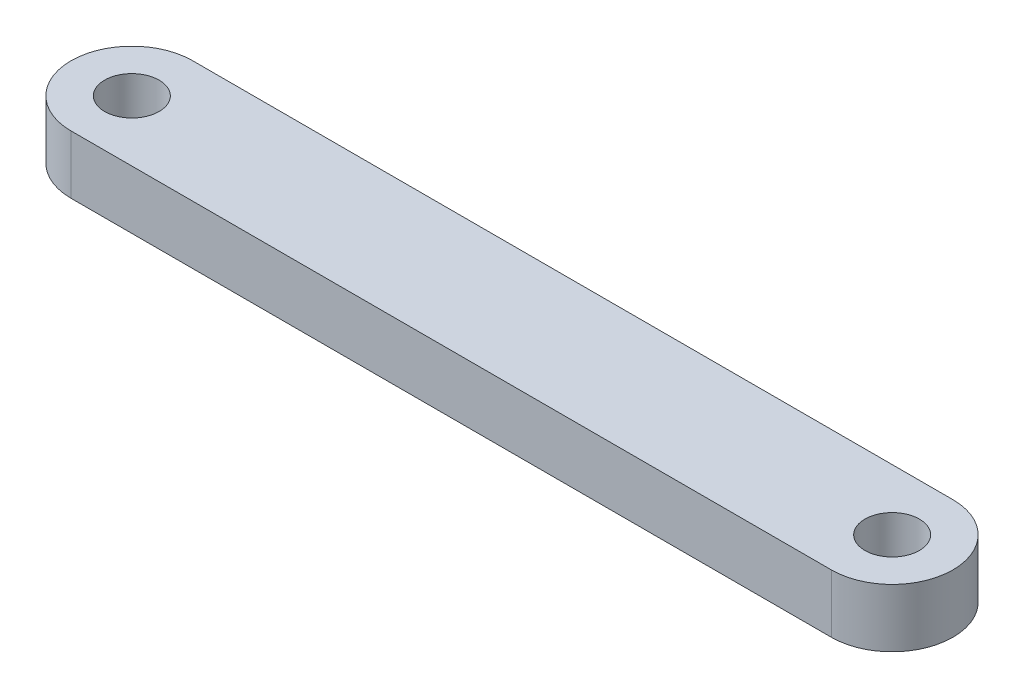
ISO-10303-21;
HEADER;
FILE_DESCRIPTION(('STEP AP214'),'2;1');
FILE_NAME('part.step','',(''),(''),'','','');
FILE_SCHEMA(('AUTOMOTIVE_DESIGN { 1 0 10303 214 1 1 1 1 }'));
ENDSEC;
DATA;
#1=APPLICATION_CONTEXT('core data for automotive mechanical design processes');
#2=APPLICATION_PROTOCOL_DEFINITION('international standard','automotive_design',2000,#1);
#3=PRODUCT_CONTEXT('',#1,'mechanical');
#4=PRODUCT('Part','Part','',(#3));
#5=PRODUCT_RELATED_PRODUCT_CATEGORY('part','',(#4));
#6=PRODUCT_DEFINITION_FORMATION('','',#4);
#7=PRODUCT_DEFINITION_CONTEXT('part definition',#1,'design');
#8=PRODUCT_DEFINITION('design','',#6,#7);
#9=PRODUCT_DEFINITION_SHAPE('','',#8);
#10=(LENGTH_UNIT() NAMED_UNIT(*) SI_UNIT(.MILLI.,.METRE.));
#11=(NAMED_UNIT(*) PLANE_ANGLE_UNIT() SI_UNIT($,.RADIAN.));
#12=(NAMED_UNIT(*) SI_UNIT($,.STERADIAN.) SOLID_ANGLE_UNIT());
#13=UNCERTAINTY_MEASURE_WITH_UNIT(LENGTH_MEASURE(1.E-05),#10,'distance_accuracy_value','');
#14=(GEOMETRIC_REPRESENTATION_CONTEXT(3) GLOBAL_UNCERTAINTY_ASSIGNED_CONTEXT((#13)) GLOBAL_UNIT_ASSIGNED_CONTEXT((#10,
#11,#12)) REPRESENTATION_CONTEXT('',''));
#15=CARTESIAN_POINT('',(0.,0.,0.));
#16=DIRECTION('',(0.,0.,1.));
#17=DIRECTION('',(1.,0.,0.));
#18=AXIS2_PLACEMENT_3D('',#15,#16,#17);
#19=CARTESIAN_POINT('',(-19.8501,3.048,0.));
#20=DIRECTION('',(0.,1.,0.));
#21=DIRECTION('',(0.,0.,1.));
#22=AXIS2_PLACEMENT_3D('',#19,#20,#21);
#23=PLANE('',#22);
#24=CARTESIAN_POINT('',(-19.8501,3.048,0.));
#25=DIRECTION('',(0.,1.,0.));
#26=DIRECTION('',(0.,0.,1.));
#27=AXIS2_PLACEMENT_3D('',#24,#25,#26);
#28=CIRCLE('',#27,1.4224);
#29=CARTESIAN_POINT('',(-19.8501,3.048,-1.4224));
#30=VERTEX_POINT('',#29);
#31=EDGE_CURVE('E100',#30,#30,#28,.T.);
#32=ORIENTED_EDGE('',*,*,#31,.F.);
#33=EDGE_LOOP('',(#32));
#34=FACE_BOUND('',#33,.T.);
#35=CARTESIAN_POINT('',(-19.8501,3.048,0.));
#36=DIRECTION('',(0.,1.,0.));
#37=DIRECTION('',(0.,0.,1.));
#38=AXIS2_PLACEMENT_3D('',#35,#36,#37);
#39=CIRCLE('',#38,3.175);
#40=CARTESIAN_POINT('',(-19.8501,3.048,-3.175));
#41=VERTEX_POINT('',#40);
#42=CARTESIAN_POINT('',(-19.8501,3.048,3.175));
#43=VERTEX_POINT('',#42);
#44=EDGE_CURVE('E85',#41,#43,#39,.T.);
#45=ORIENTED_EDGE('',*,*,#44,.T.);
#46=DIRECTION('',(1.,0.,0.));
#47=VECTOR('',#46,1.);
#48=CARTESIAN_POINT('',(-19.8501,3.048,3.175));
#49=LINE('',#48,#47);
#50=CARTESIAN_POINT('',(19.8501,3.048,3.17499999999999));
#51=VERTEX_POINT('',#50);
#52=EDGE_CURVE('E80',#43,#51,#49,.T.);
#53=ORIENTED_EDGE('',*,*,#52,.T.);
#54=CARTESIAN_POINT('',(19.8501,3.048,0.));
#55=DIRECTION('',(0.,1.,0.));
#56=DIRECTION('',(0.,0.,1.));
#57=AXIS2_PLACEMENT_3D('',#54,#55,#56);
#58=CIRCLE('',#57,3.175);
#59=CARTESIAN_POINT('',(19.8501,3.048,-3.17500000000001));
#60=VERTEX_POINT('',#59);
#61=EDGE_CURVE('E83',#51,#60,#58,.T.);
#62=ORIENTED_EDGE('',*,*,#61,.T.);
#63=DIRECTION('',(-1.,0.,0.));
#64=VECTOR('',#63,1.);
#65=CARTESIAN_POINT('',(-19.8501,3.048,-3.175));
#66=LINE('',#65,#64);
#67=EDGE_CURVE('E50',#60,#41,#66,.T.);
#68=ORIENTED_EDGE('',*,*,#67,.T.);
#69=EDGE_LOOP('',(#45,#53,#62,#68));
#70=FACE_BOUND('',#69,.T.);
#71=CARTESIAN_POINT('',(19.8501,3.048,0.));
#72=DIRECTION('',(0.,1.,0.));
#73=DIRECTION('',(0.,0.,1.));
#74=AXIS2_PLACEMENT_3D('',#71,#72,#73);
#75=CIRCLE('',#74,1.4224);
#76=CARTESIAN_POINT('',(19.8501,3.048,-1.42240000000001));
#77=VERTEX_POINT('',#76);
#78=EDGE_CURVE('E115',#77,#77,#75,.T.);
#79=ORIENTED_EDGE('',*,*,#78,.F.);
#80=EDGE_LOOP('',(#79));
#81=FACE_BOUND('',#80,.T.);
#82=ADVANCED_FACE('F33',(#34,#70,#81),#23,.T.);
#83=CARTESIAN_POINT('',(-19.8501,0.,0.));
#84=DIRECTION('',(0.,1.,0.));
#85=DIRECTION('',(0.,0.,1.));
#86=AXIS2_PLACEMENT_3D('',#83,#84,#85);
#87=PLANE('',#86);
#88=CARTESIAN_POINT('',(-19.8501,0.,0.));
#89=DIRECTION('',(0.,1.,0.));
#90=DIRECTION('',(0.,0.,1.));
#91=AXIS2_PLACEMENT_3D('',#88,#89,#90);
#92=CIRCLE('',#91,1.4224);
#93=CARTESIAN_POINT('',(-19.8501,0.,-1.4224));
#94=VERTEX_POINT('',#93);
#95=EDGE_CURVE('E112',#94,#94,#92,.T.);
#96=ORIENTED_EDGE('',*,*,#95,.T.);
#97=EDGE_LOOP('',(#96));
#98=FACE_BOUND('',#97,.T.);
#99=CARTESIAN_POINT('',(-19.8501,0.,0.));
#100=DIRECTION('',(0.,1.,0.));
#101=DIRECTION('',(0.,0.,1.));
#102=AXIS2_PLACEMENT_3D('',#99,#100,#101);
#103=CIRCLE('',#102,3.175);
#104=CARTESIAN_POINT('',(-19.8501,0.,-3.175));
#105=VERTEX_POINT('',#104);
#106=CARTESIAN_POINT('',(-19.8501,0.,3.175));
#107=VERTEX_POINT('',#106);
#108=EDGE_CURVE('E97',#105,#107,#103,.T.);
#109=ORIENTED_EDGE('',*,*,#108,.F.);
#110=DIRECTION('',(-1.,0.,0.));
#111=VECTOR('',#110,1.);
#112=CARTESIAN_POINT('',(-19.8501,0.,-3.175));
#113=LINE('',#112,#111);
#114=CARTESIAN_POINT('',(19.8501,0.,-3.17500000000001));
#115=VERTEX_POINT('',#114);
#116=EDGE_CURVE('E73',#115,#105,#113,.T.);
#117=ORIENTED_EDGE('',*,*,#116,.F.);
#118=CARTESIAN_POINT('',(19.8501,0.,0.));
#119=DIRECTION('',(0.,1.,0.));
#120=DIRECTION('',(0.,0.,1.));
#121=AXIS2_PLACEMENT_3D('',#118,#119,#120);
#122=CIRCLE('',#121,3.175);
#123=CARTESIAN_POINT('',(19.8501,0.,3.17499999999999));
#124=VERTEX_POINT('',#123);
#125=EDGE_CURVE('E67',#124,#115,#122,.T.);
#126=ORIENTED_EDGE('',*,*,#125,.F.);
#127=DIRECTION('',(1.,0.,0.));
#128=VECTOR('',#127,1.);
#129=CARTESIAN_POINT('',(-19.8501,0.,3.175));
#130=LINE('',#129,#128);
#131=EDGE_CURVE('E89',#107,#124,#130,.T.);
#132=ORIENTED_EDGE('',*,*,#131,.F.);
#133=EDGE_LOOP('',(#109,#117,#126,#132));
#134=FACE_BOUND('',#133,.T.);
#135=CARTESIAN_POINT('',(19.8501,0.,0.));
#136=DIRECTION('',(0.,1.,0.));
#137=DIRECTION('',(0.,0.,1.));
#138=AXIS2_PLACEMENT_3D('',#135,#136,#137);
#139=CIRCLE('',#138,1.4224);
#140=CARTESIAN_POINT('',(19.8501,0.,-1.42240000000001));
#141=VERTEX_POINT('',#140);
#142=EDGE_CURVE('E118',#141,#141,#139,.T.);
#143=ORIENTED_EDGE('',*,*,#142,.T.);
#144=EDGE_LOOP('',(#143));
#145=FACE_BOUND('',#144,.T.);
#146=ADVANCED_FACE('F108',(#98,#134,#145),#87,.F.);
#147=CARTESIAN_POINT('',(-19.8501,3.048,0.));
#148=DIRECTION('',(0.,-1.,0.));
#149=DIRECTION('',(0.,0.,-1.));
#150=AXIS2_PLACEMENT_3D('',#147,#148,#149);
#151=CYLINDRICAL_SURFACE('',#150,3.175);
#152=ORIENTED_EDGE('',*,*,#108,.T.);
#153=DIRECTION('',(0.,-1.,0.));
#154=VECTOR('',#153,1.);
#155=CARTESIAN_POINT('',(-19.8501,3.048,3.175));
#156=LINE('',#155,#154);
#157=EDGE_CURVE('E11',#43,#107,#156,.T.);
#158=ORIENTED_EDGE('',*,*,#157,.F.);
#159=ORIENTED_EDGE('',*,*,#44,.F.);
#160=DIRECTION('',(0.,-1.,0.));
#161=VECTOR('',#160,1.);
#162=CARTESIAN_POINT('',(-19.8501,3.048,-3.175));
#163=LINE('',#162,#161);
#164=EDGE_CURVE('E93',#41,#105,#163,.T.);
#165=ORIENTED_EDGE('',*,*,#164,.T.);
#166=EDGE_LOOP('',(#152,#158,#159,#165));
#167=FACE_BOUND('',#166,.T.);
#168=ADVANCED_FACE('F35',(#167),#151,.T.);
#169=CARTESIAN_POINT('',(-19.8501,3.048,3.175));
#170=DIRECTION('',(0.,0.,-1.));
#171=DIRECTION('',(-1.,0.,0.));
#172=AXIS2_PLACEMENT_3D('',#169,#170,#171);
#173=PLANE('',#172);
#174=ORIENTED_EDGE('',*,*,#131,.T.);
#175=DIRECTION('',(0.,-1.,0.));
#176=VECTOR('',#175,1.);
#177=CARTESIAN_POINT('',(19.8501,3.048,3.17499999999999));
#178=LINE('',#177,#176);
#179=EDGE_CURVE('E42',#51,#124,#178,.T.);
#180=ORIENTED_EDGE('',*,*,#179,.F.);
#181=ORIENTED_EDGE('',*,*,#52,.F.);
#182=ORIENTED_EDGE('',*,*,#157,.T.);
#183=EDGE_LOOP('',(#174,#180,#181,#182));
#184=FACE_BOUND('',#183,.T.);
#185=ADVANCED_FACE('F88',(#184),#173,.F.);
#186=CARTESIAN_POINT('',(19.8501,3.048,0.));
#187=DIRECTION('',(0.,-1.,0.));
#188=DIRECTION('',(0.,0.,-1.));
#189=AXIS2_PLACEMENT_3D('',#186,#187,#188);
#190=CYLINDRICAL_SURFACE('',#189,3.175);
#191=ORIENTED_EDGE('',*,*,#125,.T.);
#192=DIRECTION('',(0.,-1.,0.));
#193=VECTOR('',#192,1.);
#194=CARTESIAN_POINT('',(19.8501,3.048,-3.17500000000001));
#195=LINE('',#194,#193);
#196=EDGE_CURVE('E90',#60,#115,#195,.T.);
#197=ORIENTED_EDGE('',*,*,#196,.F.);
#198=ORIENTED_EDGE('',*,*,#61,.F.);
#199=ORIENTED_EDGE('',*,*,#179,.T.);
#200=EDGE_LOOP('',(#191,#197,#198,#199));
#201=FACE_BOUND('',#200,.T.);
#202=ADVANCED_FACE('F91',(#201),#190,.T.);
#203=CARTESIAN_POINT('',(-19.8501,3.048,-3.175));
#204=DIRECTION('',(0.,0.,1.));
#205=DIRECTION('',(1.,0.,0.));
#206=AXIS2_PLACEMENT_3D('',#203,#204,#205);
#207=PLANE('',#206);
#208=ORIENTED_EDGE('',*,*,#116,.T.);
#209=ORIENTED_EDGE('',*,*,#164,.F.);
#210=ORIENTED_EDGE('',*,*,#67,.F.);
#211=ORIENTED_EDGE('',*,*,#196,.T.);
#212=EDGE_LOOP('',(#208,#209,#210,#211));
#213=FACE_BOUND('',#212,.T.);
#214=ADVANCED_FACE('F105',(#213),#207,.F.);
#215=CARTESIAN_POINT('',(-19.8501,3.048,0.));
#216=DIRECTION('',(0.,-1.,0.));
#217=DIRECTION('',(0.,0.,-1.));
#218=AXIS2_PLACEMENT_3D('',#215,#216,#217);
#219=CYLINDRICAL_SURFACE('',#218,1.4224);
#220=CARTESIAN_POINT('',(-19.8501,3.048,-1.4224));
#221=CARTESIAN_POINT('',(-19.8501,3.01625,-1.4224));
#222=CARTESIAN_POINT('',(-19.8501,2.9845,-1.4224));
#223=CARTESIAN_POINT('',(-19.8501,2.921,-1.4224));
#224=CARTESIAN_POINT('',(-19.8501,2.88925,-1.4224));
#225=CARTESIAN_POINT('',(-19.8501,2.82575,-1.4224));
#226=CARTESIAN_POINT('',(-19.8501,2.794,-1.4224));
#227=CARTESIAN_POINT('',(-19.8501,2.7305,-1.4224));
#228=CARTESIAN_POINT('',(-19.8501,2.69875,-1.4224));
#229=CARTESIAN_POINT('',(-19.8501,2.63525,-1.4224));
#230=CARTESIAN_POINT('',(-19.8501,2.6035,-1.4224));
#231=CARTESIAN_POINT('',(-19.8501,2.54,-1.4224));
#232=CARTESIAN_POINT('',(-19.8501,2.50825,-1.4224));
#233=CARTESIAN_POINT('',(-19.8501,2.44475,-1.4224));
#234=CARTESIAN_POINT('',(-19.8501,2.413,-1.4224));
#235=CARTESIAN_POINT('',(-19.8501,2.3495,-1.4224));
#236=CARTESIAN_POINT('',(-19.8501,2.31775,-1.4224));
#237=CARTESIAN_POINT('',(-19.8501,2.25425,-1.4224));
#238=CARTESIAN_POINT('',(-19.8501,2.2225,-1.4224));
#239=CARTESIAN_POINT('',(-19.8501,2.159,-1.4224));
#240=CARTESIAN_POINT('',(-19.8501,2.12725,-1.4224));
#241=CARTESIAN_POINT('',(-19.8501,2.06375,-1.4224));
#242=CARTESIAN_POINT('',(-19.8501,2.032,-1.4224));
#243=CARTESIAN_POINT('',(-19.8501,1.9685,-1.4224));
#244=CARTESIAN_POINT('',(-19.8501,1.93675,-1.4224));
#245=CARTESIAN_POINT('',(-19.8501,1.87325,-1.4224));
#246=CARTESIAN_POINT('',(-19.8501,1.8415,-1.4224));
#247=CARTESIAN_POINT('',(-19.8501,1.778,-1.4224));
#248=CARTESIAN_POINT('',(-19.8501,1.74625,-1.4224));
#249=CARTESIAN_POINT('',(-19.8501,1.68275,-1.4224));
#250=CARTESIAN_POINT('',(-19.8501,1.651,-1.4224));
#251=CARTESIAN_POINT('',(-19.8501,1.5875,-1.4224));
#252=CARTESIAN_POINT('',(-19.8501,1.55575,-1.4224));
#253=CARTESIAN_POINT('',(-19.8501,1.49225,-1.4224));
#254=CARTESIAN_POINT('',(-19.8501,1.4605,-1.4224));
#255=CARTESIAN_POINT('',(-19.8501,1.397,-1.4224));
#256=CARTESIAN_POINT('',(-19.8501,1.36525,-1.4224));
#257=CARTESIAN_POINT('',(-19.8501,1.30175,-1.4224));
#258=CARTESIAN_POINT('',(-19.8501,1.27,-1.4224));
#259=CARTESIAN_POINT('',(-19.8501,1.2065,-1.4224));
#260=CARTESIAN_POINT('',(-19.8501,1.17475,-1.4224));
#261=CARTESIAN_POINT('',(-19.8501,1.11125,-1.4224));
#262=CARTESIAN_POINT('',(-19.8501,1.0795,-1.4224));
#263=CARTESIAN_POINT('',(-19.8501,1.016,-1.4224));
#264=CARTESIAN_POINT('',(-19.8501,0.98425,-1.4224));
#265=CARTESIAN_POINT('',(-19.8501,0.92075,-1.4224));
#266=CARTESIAN_POINT('',(-19.8501,0.889,-1.4224));
#267=CARTESIAN_POINT('',(-19.8501,0.8255,-1.4224));
#268=CARTESIAN_POINT('',(-19.8501,0.79375,-1.4224));
#269=CARTESIAN_POINT('',(-19.8501,0.73025,-1.4224));
#270=CARTESIAN_POINT('',(-19.8501,0.6985,-1.4224));
#271=CARTESIAN_POINT('',(-19.8501,0.635,-1.4224));
#272=CARTESIAN_POINT('',(-19.8501,0.60325,-1.4224));
#273=CARTESIAN_POINT('',(-19.8501,0.53975,-1.4224));
#274=CARTESIAN_POINT('',(-19.8501,0.508,-1.4224));
#275=CARTESIAN_POINT('',(-19.8501,0.4445,-1.4224));
#276=CARTESIAN_POINT('',(-19.8501,0.41275,-1.4224));
#277=CARTESIAN_POINT('',(-19.8501,0.34925,-1.4224));
#278=CARTESIAN_POINT('',(-19.8501,0.3175,-1.4224));
#279=CARTESIAN_POINT('',(-19.8501,0.254,-1.4224));
#280=CARTESIAN_POINT('',(-19.8501,0.22225,-1.4224));
#281=CARTESIAN_POINT('',(-19.8501,0.15875,-1.4224));
#282=CARTESIAN_POINT('',(-19.8501,0.127,-1.4224));
#283=CARTESIAN_POINT('',(-19.8501,0.0634999999999999,-1.4224));
#284=CARTESIAN_POINT('',(-19.8501,0.03175,-1.4224));
#285=CARTESIAN_POINT('',(-19.8501,0.,-1.4224));
#286=B_SPLINE_CURVE_WITH_KNOTS('',3,(#220,#221,#222,#223,#224,#225,#226,#227,#228,#229,#230,
#231,#232,#233,#234,#235,#236,#237,#238,#239,#240,#241,#242,#243,#244,#245,#246,#247,#248,#249,
#250,#251,#252,#253,#254,#255,#256,#257,#258,#259,#260,#261,#262,#263,#264,#265,#266,#267,#268,
#269,#270,#271,#272,#273,#274,#275,#276,#277,#278,#279,#280,#281,#282,#283,#284,#285),
.UNSPECIFIED.,.F.,.F.,(4,2,2,2,2,2,2,2,2,2,2,2,2,2,2,2,2,2,2,2,2,2,2,2,2,2,2,2,2,2,2,2,4),(0.,
0.0952499999999998,0.1905,0.28575,0.381,0.47625,0.5715,0.66675,0.762,0.85725,0.9525,1.04775,
1.143,1.23825,1.3335,1.42875,1.524,1.61925,1.7145,1.80975,1.905,2.00025,2.0955,2.19075,2.286,
2.38125,2.4765,2.57175,2.667,2.76225,2.8575,2.95275,3.048),.UNSPECIFIED.);
#287=EDGE_CURVE('BSEAM136',#30,#94,#286,.T.);
#288=ORIENTED_EDGE('',*,*,#31,.T.);
#289=ORIENTED_EDGE('',*,*,#95,.F.);
#290=ORIENTED_EDGE('',*,*,#287,.T.);
#291=ORIENTED_EDGE('',*,*,#287,.F.);
#292=EDGE_LOOP('',(#288,#290,#289,#291));
#293=FACE_BOUND('',#292,.T.);
#294=ADVANCED_FACE('F136',(#293),#219,.F.);
#295=CARTESIAN_POINT('',(19.8501,3.048,0.));
#296=DIRECTION('',(0.,-1.,0.));
#297=DIRECTION('',(0.,0.,-1.));
#298=AXIS2_PLACEMENT_3D('',#295,#296,#297);
#299=CYLINDRICAL_SURFACE('',#298,1.4224);
#300=CARTESIAN_POINT('',(19.8501,3.048,-1.42240000000001));
#301=CARTESIAN_POINT('',(19.8501,3.01625,-1.42240000000001));
#302=CARTESIAN_POINT('',(19.8501,2.9845,-1.42240000000001));
#303=CARTESIAN_POINT('',(19.8501,2.921,-1.42240000000001));
#304=CARTESIAN_POINT('',(19.8501,2.88925,-1.42240000000001));
#305=CARTESIAN_POINT('',(19.8501,2.82575,-1.42240000000001));
#306=CARTESIAN_POINT('',(19.8501,2.794,-1.42240000000001));
#307=CARTESIAN_POINT('',(19.8501,2.7305,-1.42240000000001));
#308=CARTESIAN_POINT('',(19.8501,2.69875,-1.42240000000001));
#309=CARTESIAN_POINT('',(19.8501,2.63525,-1.42240000000001));
#310=CARTESIAN_POINT('',(19.8501,2.6035,-1.42240000000001));
#311=CARTESIAN_POINT('',(19.8501,2.54,-1.42240000000001));
#312=CARTESIAN_POINT('',(19.8501,2.50825,-1.42240000000001));
#313=CARTESIAN_POINT('',(19.8501,2.44475,-1.42240000000001));
#314=CARTESIAN_POINT('',(19.8501,2.413,-1.42240000000001));
#315=CARTESIAN_POINT('',(19.8501,2.3495,-1.42240000000001));
#316=CARTESIAN_POINT('',(19.8501,2.31775,-1.42240000000001));
#317=CARTESIAN_POINT('',(19.8501,2.25425,-1.42240000000001));
#318=CARTESIAN_POINT('',(19.8501,2.2225,-1.42240000000001));
#319=CARTESIAN_POINT('',(19.8501,2.159,-1.42240000000001));
#320=CARTESIAN_POINT('',(19.8501,2.12725,-1.42240000000001));
#321=CARTESIAN_POINT('',(19.8501,2.06375,-1.42240000000001));
#322=CARTESIAN_POINT('',(19.8501,2.032,-1.42240000000001));
#323=CARTESIAN_POINT('',(19.8501,1.9685,-1.42240000000001));
#324=CARTESIAN_POINT('',(19.8501,1.93675,-1.42240000000001));
#325=CARTESIAN_POINT('',(19.8501,1.87325,-1.42240000000001));
#326=CARTESIAN_POINT('',(19.8501,1.8415,-1.42240000000001));
#327=CARTESIAN_POINT('',(19.8501,1.778,-1.42240000000001));
#328=CARTESIAN_POINT('',(19.8501,1.74625,-1.42240000000001));
#329=CARTESIAN_POINT('',(19.8501,1.68275,-1.42240000000001));
#330=CARTESIAN_POINT('',(19.8501,1.651,-1.42240000000001));
#331=CARTESIAN_POINT('',(19.8501,1.5875,-1.42240000000001));
#332=CARTESIAN_POINT('',(19.8501,1.55575,-1.42240000000001));
#333=CARTESIAN_POINT('',(19.8501,1.49225,-1.42240000000001));
#334=CARTESIAN_POINT('',(19.8501,1.4605,-1.42240000000001));
#335=CARTESIAN_POINT('',(19.8501,1.397,-1.42240000000001));
#336=CARTESIAN_POINT('',(19.8501,1.36525,-1.42240000000001));
#337=CARTESIAN_POINT('',(19.8501,1.30175,-1.42240000000001));
#338=CARTESIAN_POINT('',(19.8501,1.27,-1.42240000000001));
#339=CARTESIAN_POINT('',(19.8501,1.2065,-1.42240000000001));
#340=CARTESIAN_POINT('',(19.8501,1.17475,-1.42240000000001));
#341=CARTESIAN_POINT('',(19.8501,1.11125,-1.42240000000001));
#342=CARTESIAN_POINT('',(19.8501,1.0795,-1.42240000000001));
#343=CARTESIAN_POINT('',(19.8501,1.016,-1.42240000000001));
#344=CARTESIAN_POINT('',(19.8501,0.98425,-1.42240000000001));
#345=CARTESIAN_POINT('',(19.8501,0.92075,-1.42240000000001));
#346=CARTESIAN_POINT('',(19.8501,0.889,-1.42240000000001));
#347=CARTESIAN_POINT('',(19.8501,0.8255,-1.42240000000001));
#348=CARTESIAN_POINT('',(19.8501,0.79375,-1.42240000000001));
#349=CARTESIAN_POINT('',(19.8501,0.73025,-1.42240000000001));
#350=CARTESIAN_POINT('',(19.8501,0.6985,-1.42240000000001));
#351=CARTESIAN_POINT('',(19.8501,0.635,-1.42240000000001));
#352=CARTESIAN_POINT('',(19.8501,0.60325,-1.42240000000001));
#353=CARTESIAN_POINT('',(19.8501,0.53975,-1.42240000000001));
#354=CARTESIAN_POINT('',(19.8501,0.508,-1.42240000000001));
#355=CARTESIAN_POINT('',(19.8501,0.4445,-1.42240000000001));
#356=CARTESIAN_POINT('',(19.8501,0.41275,-1.42240000000001));
#357=CARTESIAN_POINT('',(19.8501,0.34925,-1.42240000000001));
#358=CARTESIAN_POINT('',(19.8501,0.3175,-1.42240000000001));
#359=CARTESIAN_POINT('',(19.8501,0.254,-1.42240000000001));
#360=CARTESIAN_POINT('',(19.8501,0.22225,-1.42240000000001));
#361=CARTESIAN_POINT('',(19.8501,0.15875,-1.42240000000001));
#362=CARTESIAN_POINT('',(19.8501,0.127,-1.42240000000001));
#363=CARTESIAN_POINT('',(19.8501,0.0634999999999999,-1.42240000000001));
#364=CARTESIAN_POINT('',(19.8501,0.03175,-1.42240000000001));
#365=CARTESIAN_POINT('',(19.8501,0.,-1.42240000000001));
#366=B_SPLINE_CURVE_WITH_KNOTS('',3,(#300,#301,#302,#303,#304,#305,#306,#307,#308,#309,#310,
#311,#312,#313,#314,#315,#316,#317,#318,#319,#320,#321,#322,#323,#324,#325,#326,#327,#328,#329,
#330,#331,#332,#333,#334,#335,#336,#337,#338,#339,#340,#341,#342,#343,#344,#345,#346,#347,#348,
#349,#350,#351,#352,#353,#354,#355,#356,#357,#358,#359,#360,#361,#362,#363,#364,#365),
.UNSPECIFIED.,.F.,.F.,(4,2,2,2,2,2,2,2,2,2,2,2,2,2,2,2,2,2,2,2,2,2,2,2,2,2,2,2,2,2,2,2,4),(0.,
0.0952499999999998,0.1905,0.28575,0.381,0.47625,0.5715,0.66675,0.762,0.85725,0.9525,1.04775,
1.143,1.23825,1.3335,1.42875,1.524,1.61925,1.7145,1.80975,1.905,2.00025,2.0955,2.19075,2.286,
2.38125,2.4765,2.57175,2.667,2.76225,2.8575,2.95275,3.048),.UNSPECIFIED.);
#367=EDGE_CURVE('BSEAM124',#77,#141,#366,.T.);
#368=ORIENTED_EDGE('',*,*,#78,.T.);
#369=ORIENTED_EDGE('',*,*,#142,.F.);
#370=ORIENTED_EDGE('',*,*,#367,.T.);
#371=ORIENTED_EDGE('',*,*,#367,.F.);
#372=EDGE_LOOP('',(#368,#370,#369,#371));
#373=FACE_BOUND('',#372,.T.);
#374=ADVANCED_FACE('F124',(#373),#299,.F.);
#375=CLOSED_SHELL('',(#82,#146,#168,#185,#202,#214,#294,#374));
#376=MANIFOLD_SOLID_BREP('B2',#375);
#377=ADVANCED_BREP_SHAPE_REPRESENTATION('',(#18,#376),#14);
#378=SHAPE_DEFINITION_REPRESENTATION(#9,#377);
ENDSEC;
END-ISO-10303-21;
